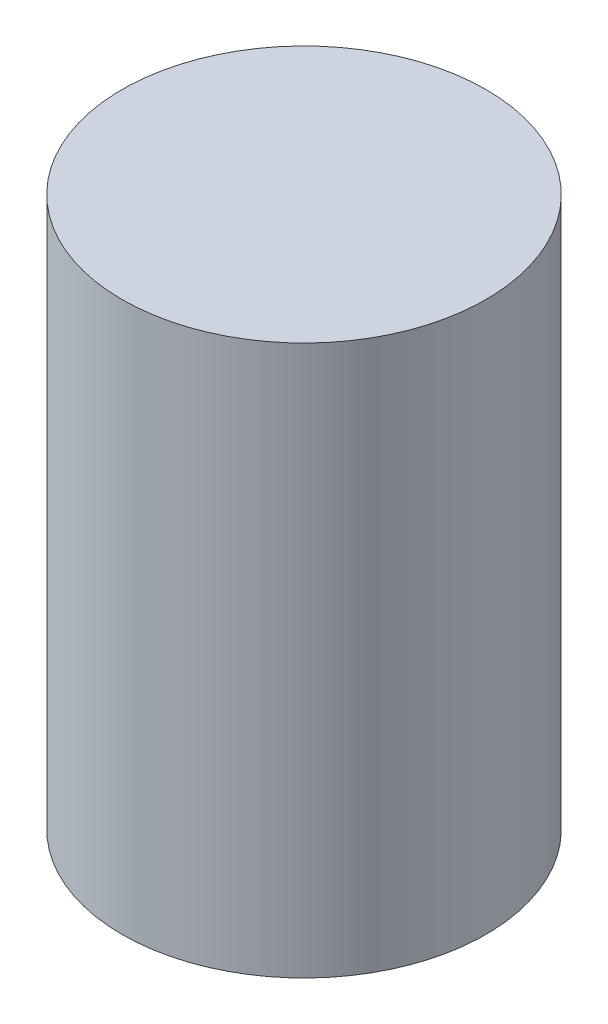
ISO-10303-21;
HEADER;
FILE_DESCRIPTION(('STEP AP214'),'2;1');
FILE_NAME('part.step','',(''),(''),'','','');
FILE_SCHEMA(('AUTOMOTIVE_DESIGN { 1 0 10303 214 1 1 1 1 }'));
ENDSEC;
DATA;
#1=APPLICATION_CONTEXT('core data for automotive mechanical design processes');
#2=APPLICATION_PROTOCOL_DEFINITION('international standard','automotive_design',2000,#1);
#3=PRODUCT_CONTEXT('',#1,'mechanical');
#4=PRODUCT('Part','Part','',(#3));
#5=PRODUCT_RELATED_PRODUCT_CATEGORY('part','',(#4));
#6=PRODUCT_DEFINITION_FORMATION('','',#4);
#7=PRODUCT_DEFINITION_CONTEXT('part definition',#1,'design');
#8=PRODUCT_DEFINITION('design','',#6,#7);
#9=PRODUCT_DEFINITION_SHAPE('','',#8);
#10=(LENGTH_UNIT() NAMED_UNIT(*) SI_UNIT(.MILLI.,.METRE.));
#11=(NAMED_UNIT(*) PLANE_ANGLE_UNIT() SI_UNIT($,.RADIAN.));
#12=(NAMED_UNIT(*) SI_UNIT($,.STERADIAN.) SOLID_ANGLE_UNIT());
#13=UNCERTAINTY_MEASURE_WITH_UNIT(LENGTH_MEASURE(1.E-05),#10,'distance_accuracy_value','');
#14=(GEOMETRIC_REPRESENTATION_CONTEXT(3) GLOBAL_UNCERTAINTY_ASSIGNED_CONTEXT((#13)) GLOBAL_UNIT_ASSIGNED_CONTEXT((#10,
#11,#12)) REPRESENTATION_CONTEXT('',''));
#15=CARTESIAN_POINT('',(0.,0.,0.));
#16=DIRECTION('',(0.,0.,1.));
#17=DIRECTION('',(1.,0.,0.));
#18=AXIS2_PLACEMENT_3D('',#15,#16,#17);
#19=CARTESIAN_POINT('',(-7.137,-27.617,-2.617));
#20=DIRECTION('',(0.,1.,0.));
#21=DIRECTION('',(0.,0.,1.));
#22=AXIS2_PLACEMENT_3D('',#19,#20,#21);
#23=CYLINDRICAL_SURFACE('',#22,9.137);
#24=CARTESIAN_POINT('',(-7.137,-27.617,-2.617));
#25=DIRECTION('',(0.,1.,0.));
#26=DIRECTION('',(0.,0.,1.));
#27=AXIS2_PLACEMENT_3D('',#24,#25,#26);
#28=CIRCLE('',#27,9.137);
#29=CARTESIAN_POINT('',(-7.137,-27.617,6.52));
#30=VERTEX_POINT('',#29);
#31=EDGE_CURVE('E10',#30,#30,#28,.T.);
#32=CARTESIAN_POINT('',(-7.137,0.,-2.617));
#33=DIRECTION('',(0.,1.,0.));
#34=DIRECTION('',(0.,0.,1.));
#35=AXIS2_PLACEMENT_3D('',#32,#33,#34);
#36=CIRCLE('',#35,9.137);
#37=CARTESIAN_POINT('',(-7.137,0.,6.52));
#38=VERTEX_POINT('',#37);
#39=EDGE_CURVE('E45',#38,#38,#36,.T.);
#40=CARTESIAN_POINT('',(-7.137,-27.617,6.52));
#41=CARTESIAN_POINT('',(-7.137,-27.3293229166667,6.52));
#42=CARTESIAN_POINT('',(-7.137,-27.0416458333333,6.52));
#43=CARTESIAN_POINT('',(-7.137,-26.4662916666667,6.52));
#44=CARTESIAN_POINT('',(-7.137,-26.1786145833333,6.52));
#45=CARTESIAN_POINT('',(-7.137,-25.6032604166667,6.52));
#46=CARTESIAN_POINT('',(-7.137,-25.3155833333333,6.52));
#47=CARTESIAN_POINT('',(-7.137,-24.7402291666667,6.52));
#48=CARTESIAN_POINT('',(-7.137,-24.4525520833333,6.52));
#49=CARTESIAN_POINT('',(-7.137,-23.8771979166667,6.52));
#50=CARTESIAN_POINT('',(-7.137,-23.5895208333333,6.52));
#51=CARTESIAN_POINT('',(-7.137,-23.0141666666667,6.52));
#52=CARTESIAN_POINT('',(-7.137,-22.7264895833333,6.52));
#53=CARTESIAN_POINT('',(-7.137,-22.1511354166667,6.52));
#54=CARTESIAN_POINT('',(-7.137,-21.8634583333333,6.52));
#55=CARTESIAN_POINT('',(-7.137,-21.2881041666667,6.52));
#56=CARTESIAN_POINT('',(-7.137,-21.0004270833333,6.52));
#57=CARTESIAN_POINT('',(-7.137,-20.4250729166667,6.52));
#58=CARTESIAN_POINT('',(-7.137,-20.1373958333333,6.52));
#59=CARTESIAN_POINT('',(-7.137,-19.5620416666667,6.52));
#60=CARTESIAN_POINT('',(-7.137,-19.2743645833333,6.52));
#61=CARTESIAN_POINT('',(-7.137,-18.6990104166667,6.52));
#62=CARTESIAN_POINT('',(-7.137,-18.4113333333333,6.52));
#63=CARTESIAN_POINT('',(-7.137,-17.8359791666667,6.52));
#64=CARTESIAN_POINT('',(-7.137,-17.5483020833333,6.52));
#65=CARTESIAN_POINT('',(-7.137,-16.9729479166667,6.52));
#66=CARTESIAN_POINT('',(-7.137,-16.6852708333333,6.52));
#67=CARTESIAN_POINT('',(-7.137,-16.1099166666667,6.52));
#68=CARTESIAN_POINT('',(-7.137,-15.8222395833333,6.52));
#69=CARTESIAN_POINT('',(-7.137,-15.2468854166667,6.52));
#70=CARTESIAN_POINT('',(-7.137,-14.9592083333333,6.52));
#71=CARTESIAN_POINT('',(-7.137,-14.3838541666667,6.52));
#72=CARTESIAN_POINT('',(-7.137,-14.0961770833333,6.52));
#73=CARTESIAN_POINT('',(-7.137,-13.5208229166667,6.52));
#74=CARTESIAN_POINT('',(-7.137,-13.2331458333333,6.52));
#75=CARTESIAN_POINT('',(-7.137,-12.6577916666667,6.52));
#76=CARTESIAN_POINT('',(-7.137,-12.3701145833333,6.52));
#77=CARTESIAN_POINT('',(-7.137,-11.7947604166667,6.52));
#78=CARTESIAN_POINT('',(-7.137,-11.5070833333333,6.52));
#79=CARTESIAN_POINT('',(-7.137,-10.9317291666667,6.52));
#80=CARTESIAN_POINT('',(-7.137,-10.6440520833333,6.52));
#81=CARTESIAN_POINT('',(-7.137,-10.0686979166667,6.52));
#82=CARTESIAN_POINT('',(-7.137,-9.78102083333333,6.52));
#83=CARTESIAN_POINT('',(-7.137,-9.20566666666667,6.52));
#84=CARTESIAN_POINT('',(-7.137,-8.91798958333333,6.52));
#85=CARTESIAN_POINT('',(-7.137,-8.34263541666667,6.52));
#86=CARTESIAN_POINT('',(-7.137,-8.05495833333333,6.52));
#87=CARTESIAN_POINT('',(-7.137,-7.47960416666667,6.52));
#88=CARTESIAN_POINT('',(-7.137,-7.19192708333333,6.52));
#89=CARTESIAN_POINT('',(-7.137,-6.61657291666667,6.52));
#90=CARTESIAN_POINT('',(-7.137,-6.32889583333333,6.52));
#91=CARTESIAN_POINT('',(-7.137,-5.75354166666667,6.52));
#92=CARTESIAN_POINT('',(-7.137,-5.46586458333333,6.52));
#93=CARTESIAN_POINT('',(-7.137,-4.89051041666667,6.52));
#94=CARTESIAN_POINT('',(-7.137,-4.60283333333333,6.52));
#95=CARTESIAN_POINT('',(-7.137,-4.02747916666667,6.52));
#96=CARTESIAN_POINT('',(-7.137,-3.73980208333333,6.52));
#97=CARTESIAN_POINT('',(-7.137,-3.16444791666667,6.52));
#98=CARTESIAN_POINT('',(-7.137,-2.87677083333333,6.52));
#99=CARTESIAN_POINT('',(-7.137,-2.30141666666667,6.52));
#100=CARTESIAN_POINT('',(-7.137,-2.01373958333333,6.52));
#101=CARTESIAN_POINT('',(-7.137,-1.43838541666667,6.52));
#102=CARTESIAN_POINT('',(-7.137,-1.15070833333333,6.52));
#103=CARTESIAN_POINT('',(-7.137,-0.575354166666667,6.52));
#104=CARTESIAN_POINT('',(-7.137,-0.287677083333333,6.52));
#105=CARTESIAN_POINT('',(-7.137,0.,6.52));
#106=B_SPLINE_CURVE_WITH_KNOTS('',3,(#40,#41,#42,#43,#44,#45,#46,#47,#48,#49,#50,#51,#52,#53,
#54,#55,#56,#57,#58,#59,#60,#61,#62,#63,#64,#65,#66,#67,#68,#69,#70,#71,#72,#73,#74,#75,#76,#77,
#78,#79,#80,#81,#82,#83,#84,#85,#86,#87,#88,#89,#90,#91,#92,#93,#94,#95,#96,#97,#98,#99,#100,
#101,#102,#103,#104,#105),.UNSPECIFIED.,.F.,.F.,(4,2,2,2,2,2,2,2,2,2,2,2,2,2,2,2,2,2,2,2,2,2,2,
2,2,2,2,2,2,2,2,2,4),(0.,0.863031249999997,1.7260625,2.58909375,3.452125,4.31515625,5.1781875,
6.04121875,6.90425,7.76728125,8.6303125,9.49334375,10.356375,11.21940625,12.0824375,12.94546875,
13.8085,14.67153125,15.5345625,16.39759375,17.260625,18.12365625,18.9866875,19.84971875,
20.71275,21.57578125,22.4388125,23.30184375,24.164875,25.02790625,25.8909375,26.75396875,
27.617),.UNSPECIFIED.);
#107=EDGE_CURVE('BSEAM39',#30,#38,#106,.T.);
#108=ORIENTED_EDGE('',*,*,#31,.T.);
#109=ORIENTED_EDGE('',*,*,#39,.F.);
#110=ORIENTED_EDGE('',*,*,#107,.T.);
#111=ORIENTED_EDGE('',*,*,#107,.F.);
#112=EDGE_LOOP('',(#108,#110,#109,#111));
#113=FACE_BOUND('',#112,.T.);
#114=ADVANCED_FACE('F39',(#113),#23,.T.);
#115=CARTESIAN_POINT('',(-7.137,-27.617,-2.617));
#116=DIRECTION('',(0.,1.,0.));
#117=DIRECTION('',(0.,0.,1.));
#118=AXIS2_PLACEMENT_3D('',#115,#116,#117);
#119=PLANE('',#118);
#120=ORIENTED_EDGE('',*,*,#31,.F.);
#121=EDGE_LOOP('',(#120));
#122=FACE_BOUND('',#121,.T.);
#123=ADVANCED_FACE('F53',(#122),#119,.F.);
#124=CARTESIAN_POINT('',(-7.137,0.,-2.617));
#125=DIRECTION('',(0.,1.,0.));
#126=DIRECTION('',(0.,0.,1.));
#127=AXIS2_PLACEMENT_3D('',#124,#125,#126);
#128=PLANE('',#127);
#129=ORIENTED_EDGE('',*,*,#39,.T.);
#130=EDGE_LOOP('',(#129));
#131=FACE_BOUND('',#130,.T.);
#132=ADVANCED_FACE('F51',(#131),#128,.T.);
#133=CLOSED_SHELL('',(#114,#123,#132));
#134=MANIFOLD_SOLID_BREP('B2',#133);
#135=ADVANCED_BREP_SHAPE_REPRESENTATION('',(#18,#134),#14);
#136=SHAPE_DEFINITION_REPRESENTATION(#9,#135);
ENDSEC;
END-ISO-10303-21;
